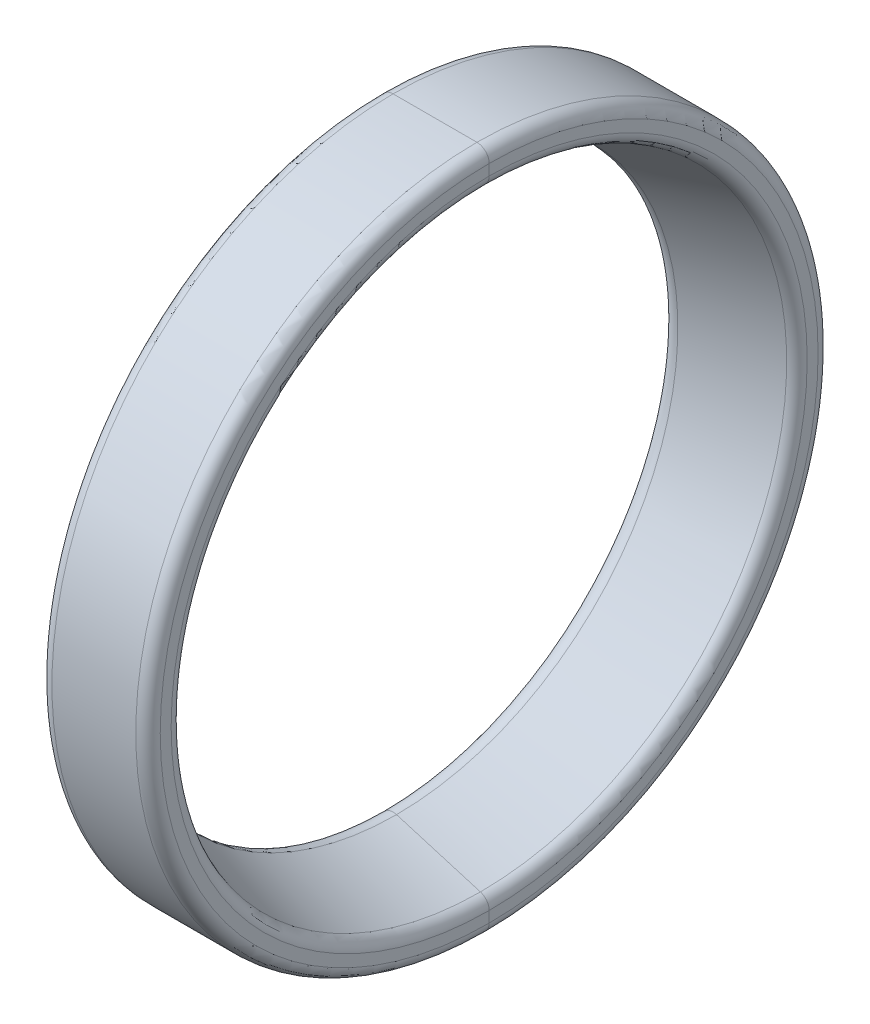
ISO-10303-21;
HEADER;
FILE_DESCRIPTION(('STEP AP214'),'2;1');
FILE_NAME('part.step','',(''),(''),'','','');
FILE_SCHEMA(('AUTOMOTIVE_DESIGN { 1 0 10303 214 1 1 1 1 }'));
ENDSEC;
DATA;
#1=APPLICATION_CONTEXT('core data for automotive mechanical design processes');
#2=APPLICATION_PROTOCOL_DEFINITION('international standard','automotive_design',2000,#1);
#3=PRODUCT_CONTEXT('',#1,'mechanical');
#4=PRODUCT('Part','Part','',(#3));
#5=PRODUCT_RELATED_PRODUCT_CATEGORY('part','',(#4));
#6=PRODUCT_DEFINITION_FORMATION('','',#4);
#7=PRODUCT_DEFINITION_CONTEXT('part definition',#1,'design');
#8=PRODUCT_DEFINITION('design','',#6,#7);
#9=PRODUCT_DEFINITION_SHAPE('','',#8);
#10=(LENGTH_UNIT() NAMED_UNIT(*) SI_UNIT(.MILLI.,.METRE.));
#11=(NAMED_UNIT(*) PLANE_ANGLE_UNIT() SI_UNIT($,.RADIAN.));
#12=(NAMED_UNIT(*) SI_UNIT($,.STERADIAN.) SOLID_ANGLE_UNIT());
#13=UNCERTAINTY_MEASURE_WITH_UNIT(LENGTH_MEASURE(1.E-05),#10,'distance_accuracy_value','');
#14=(GEOMETRIC_REPRESENTATION_CONTEXT(3) GLOBAL_UNCERTAINTY_ASSIGNED_CONTEXT((#13)) GLOBAL_UNIT_ASSIGNED_CONTEXT((#10,
#11,#12)) REPRESENTATION_CONTEXT('',''));
#15=CARTESIAN_POINT('',(0.,0.,0.));
#16=DIRECTION('',(0.,0.,1.));
#17=DIRECTION('',(1.,0.,0.));
#18=AXIS2_PLACEMENT_3D('',#15,#16,#17);
#19=CARTESIAN_POINT('',(5.22351000000001,0.,0.));
#20=DIRECTION('',(-1.,0.,0.));
#21=DIRECTION('',(0.,0.,1.));
#22=AXIS2_PLACEMENT_3D('',#19,#20,#21);
#23=TOROIDAL_SURFACE('',#22,40.97655,1.524);
#24=CARTESIAN_POINT('',(6.74751000000001,0.,0.));
#25=DIRECTION('',(-1.,0.,0.));
#26=DIRECTION('',(0.,0.,1.));
#27=AXIS2_PLACEMENT_3D('',#24,#25,#26);
#28=CIRCLE('',#27,40.97655);
#29=CARTESIAN_POINT('',(6.74751000000001,40.97655,2.86137719310345E-13));
#30=VERTEX_POINT('',#29);
#31=CARTESIAN_POINT('',(6.74751000000001,-40.97655,0.));
#32=VERTEX_POINT('',#31);
#33=EDGE_CURVE('E12',#30,#32,#28,.T.);
#34=ORIENTED_EDGE('',*,*,#33,.T.);
#35=CARTESIAN_POINT('',(5.22351000000001,-40.97655,0.));
#36=DIRECTION('',(0.,0.,1.));
#37=DIRECTION('',(1.,0.,0.));
#38=AXIS2_PLACEMENT_3D('',#35,#36,#37);
#39=CIRCLE('',#38,1.524);
#40=CARTESIAN_POINT('',(5.22351000000001,-42.50055,0.));
#41=VERTEX_POINT('',#40);
#42=EDGE_CURVE('E107',#41,#32,#39,.T.);
#43=ORIENTED_EDGE('',*,*,#42,.F.);
#44=CARTESIAN_POINT('',(5.22351000000001,0.,0.));
#45=DIRECTION('',(-1.,0.,0.));
#46=DIRECTION('',(0.,0.,1.));
#47=AXIS2_PLACEMENT_3D('',#44,#45,#46);
#48=CIRCLE('',#47,42.50055);
#49=CARTESIAN_POINT('',(5.22351000000001,42.50055,2.96779754431139E-13));
#50=VERTEX_POINT('',#49);
#51=EDGE_CURVE('E58',#50,#41,#48,.T.);
#52=ORIENTED_EDGE('',*,*,#51,.F.);
#53=CARTESIAN_POINT('',(5.22351000000001,40.97655,2.86137719310345E-13));
#54=DIRECTION('',(0.,0.,-1.));
#55=DIRECTION('',(1.,0.,0.));
#56=AXIS2_PLACEMENT_3D('',#53,#54,#55);
#57=CIRCLE('',#56,1.524);
#58=EDGE_CURVE('E109',#50,#30,#57,.T.);
#59=ORIENTED_EDGE('',*,*,#58,.T.);
#60=EDGE_LOOP('',(#34,#43,#52,#59));
#61=FACE_BOUND('',#60,.T.);
#62=ADVANCED_FACE('F43',(#61),#23,.T.);
#63=CARTESIAN_POINT('',(6.74751000000001,40.97655,2.86137719310345E-13));
#64=DIRECTION('',(1.,0.,0.));
#65=DIRECTION('',(0.,0.,-1.));
#66=AXIS2_PLACEMENT_3D('',#63,#64,#65);
#67=PLANE('',#66);
#68=CARTESIAN_POINT('',(6.74751000000001,0.,0.));
#69=DIRECTION('',(-1.,0.,0.));
#70=DIRECTION('',(0.,0.,1.));
#71=AXIS2_PLACEMENT_3D('',#68,#69,#70);
#72=CIRCLE('',#71,39.6172361810625);
#73=CARTESIAN_POINT('',(6.74751000000001,39.6172361810625,2.76645681645441E-13));
#74=VERTEX_POINT('',#73);
#75=CARTESIAN_POINT('',(6.74751000000001,-39.6172361810625,0.));
#76=VERTEX_POINT('',#75);
#77=EDGE_CURVE('E51',#74,#76,#72,.T.);
#78=ORIENTED_EDGE('',*,*,#77,.T.);
#79=DIRECTION('',(0.,1.,0.));
#80=VECTOR('',#79,1.);
#81=CARTESIAN_POINT('',(6.74751000000001,-40.97655,0.));
#82=LINE('',#81,#80);
#83=EDGE_CURVE('E118',#32,#76,#82,.T.);
#84=ORIENTED_EDGE('',*,*,#83,.F.);
#85=ORIENTED_EDGE('',*,*,#33,.F.);
#86=DIRECTION('',(0.,-1.,0.));
#87=VECTOR('',#86,1.);
#88=CARTESIAN_POINT('',(6.74751000000001,40.97655,2.86137719310345E-13));
#89=LINE('',#88,#87);
#90=EDGE_CURVE('E140',#30,#74,#89,.T.);
#91=ORIENTED_EDGE('',*,*,#90,.T.);
#92=EDGE_LOOP('',(#78,#84,#85,#91));
#93=FACE_BOUND('',#92,.T.);
#94=ADVANCED_FACE('F45',(#93),#67,.T.);
#95=CARTESIAN_POINT('',(5.22351000000001,0.,0.));
#96=DIRECTION('',(-1.,0.,0.));
#97=DIRECTION('',(0.,0.,1.));
#98=AXIS2_PLACEMENT_3D('',#95,#96,#97);
#99=TOROIDAL_SURFACE('',#98,39.6172361810625,1.524);
#100=CARTESIAN_POINT('',(5.65855214200513,0.,0.));
#101=DIRECTION('',(-1.,0.,0.));
#102=DIRECTION('',(0.,0.,1.));
#103=AXIS2_PLACEMENT_3D('',#100,#101,#102);
#104=CIRCLE('',#103,38.156649198141);
#105=CARTESIAN_POINT('',(5.65855214200513,38.156649198141,2.66446457256186E-13));
#106=VERTEX_POINT('',#105);
#107=CARTESIAN_POINT('',(5.65855214200513,-38.156649198141,0.));
#108=VERTEX_POINT('',#107);
#109=EDGE_CURVE('E166',#106,#108,#104,.T.);
#110=ORIENTED_EDGE('',*,*,#109,.T.);
#111=CARTESIAN_POINT('',(5.22351000000001,-39.6172361810625,0.));
#112=DIRECTION('',(0.,0.,1.));
#113=DIRECTION('',(1.,0.,0.));
#114=AXIS2_PLACEMENT_3D('',#111,#112,#113);
#115=CIRCLE('',#114,1.524);
#116=EDGE_CURVE('E123',#76,#108,#115,.T.);
#117=ORIENTED_EDGE('',*,*,#116,.F.);
#118=ORIENTED_EDGE('',*,*,#77,.F.);
#119=CARTESIAN_POINT('',(5.22351000000001,39.6172361810625,2.76645681645441E-13));
#120=DIRECTION('',(0.,0.,-1.));
#121=DIRECTION('',(1.,0.,0.));
#122=AXIS2_PLACEMENT_3D('',#119,#120,#121);
#123=CIRCLE('',#122,1.524);
#124=EDGE_CURVE('E142',#74,#106,#123,.T.);
#125=ORIENTED_EDGE('',*,*,#124,.T.);
#126=EDGE_LOOP('',(#110,#117,#118,#125));
#127=FACE_BOUND('',#126,.T.);
#128=ADVANCED_FACE('F168',(#127),#99,.T.);
#129=CARTESIAN_POINT('',(5.65855214200513,0.,0.));
#130=DIRECTION('',(1.,0.,0.));
#131=DIRECTION('',(0.,0.,-1.));
#132=AXIS2_PLACEMENT_3D('',#129,#130,#131);
#133=CONICAL_SURFACE('',#132,38.156649198141,0.289487119689315);
#134=CARTESIAN_POINT('',(-4.78846785799487,0.,0.));
#135=DIRECTION('',(-1.,0.,0.));
#136=DIRECTION('',(0.,0.,1.));
#137=AXIS2_PLACEMENT_3D('',#134,#135,#136);
#138=CIRCLE('',#137,35.0449591642618);
#139=CARTESIAN_POINT('',(-4.78846785799487,35.0449591642618,2.4471764188508E-13));
#140=VERTEX_POINT('',#139);
#141=CARTESIAN_POINT('',(-4.78846785799487,-35.0449591642618,0.));
#142=VERTEX_POINT('',#141);
#143=EDGE_CURVE('E164',#140,#142,#138,.T.);
#144=ORIENTED_EDGE('',*,*,#143,.T.);
#145=DIRECTION('',(-0.958390408741112,0.285460723100473,0.));
#146=VECTOR('',#145,1.);
#147=CARTESIAN_POINT('',(-4.78846785799487,-35.0449591642618,0.));
#148=LINE('',#147,#146);
#149=EDGE_CURVE('E125',#108,#142,#148,.T.);
#150=ORIENTED_EDGE('',*,*,#149,.F.);
#151=ORIENTED_EDGE('',*,*,#109,.F.);
#152=DIRECTION('',(-0.958390408741112,-0.285460723100473,0.));
#153=VECTOR('',#152,1.);
#154=CARTESIAN_POINT('',(-4.78846785799487,35.0449591642618,2.4471764188508E-13));
#155=LINE('',#154,#153);
#156=EDGE_CURVE('E145',#106,#140,#155,.T.);
#157=ORIENTED_EDGE('',*,*,#156,.T.);
#158=EDGE_LOOP('',(#144,#150,#151,#157));
#159=FACE_BOUND('',#158,.T.);
#160=ADVANCED_FACE('F174',(#159),#133,.F.);
#161=CARTESIAN_POINT('',(-5.22350999999999,0.,0.));
#162=DIRECTION('',(-1.,0.,0.));
#163=DIRECTION('',(0.,0.,1.));
#164=AXIS2_PLACEMENT_3D('',#161,#162,#163);
#165=TOROIDAL_SURFACE('',#164,36.5055461471833,1.524);
#166=CARTESIAN_POINT('',(-6.74750999999998,0.,0.));
#167=DIRECTION('',(-1.,0.,0.));
#168=DIRECTION('',(0.,0.,1.));
#169=AXIS2_PLACEMENT_3D('',#166,#167,#168);
#170=CIRCLE('',#169,36.5055461471833);
#171=CARTESIAN_POINT('',(-6.74750999999999,36.5055461471833,2.54916866274335E-13));
#172=VERTEX_POINT('',#171);
#173=CARTESIAN_POINT('',(-6.74750999999999,-36.5055461471833,0.));
#174=VERTEX_POINT('',#173);
#175=EDGE_CURVE('E162',#172,#174,#170,.T.);
#176=ORIENTED_EDGE('',*,*,#175,.T.);
#177=CARTESIAN_POINT('',(-5.22350999999999,-36.5055461471833,0.));
#178=DIRECTION('',(0.,0.,1.));
#179=DIRECTION('',(-1.,0.,0.));
#180=AXIS2_PLACEMENT_3D('',#177,#178,#179);
#181=CIRCLE('',#180,1.524);
#182=EDGE_CURVE('E130',#142,#174,#181,.T.);
#183=ORIENTED_EDGE('',*,*,#182,.F.);
#184=ORIENTED_EDGE('',*,*,#143,.F.);
#185=CARTESIAN_POINT('',(-5.22350999999999,36.5055461471833,2.54916866274335E-13));
#186=DIRECTION('',(0.,0.,-1.));
#187=DIRECTION('',(-1.,0.,0.));
#188=AXIS2_PLACEMENT_3D('',#185,#186,#187);
#189=CIRCLE('',#188,1.524);
#190=EDGE_CURVE('E148',#140,#172,#189,.T.);
#191=ORIENTED_EDGE('',*,*,#190,.T.);
#192=EDGE_LOOP('',(#176,#183,#184,#191));
#193=FACE_BOUND('',#192,.T.);
#194=ADVANCED_FACE('F177',(#193),#165,.T.);
#195=CARTESIAN_POINT('',(-6.74750999999999,40.97655,2.86137719310345E-13));
#196=DIRECTION('',(-1.,0.,0.));
#197=DIRECTION('',(0.,0.,1.));
#198=AXIS2_PLACEMENT_3D('',#195,#196,#197);
#199=PLANE('',#198);
#200=CARTESIAN_POINT('',(-6.74750999999998,0.,0.));
#201=DIRECTION('',(-1.,0.,0.));
#202=DIRECTION('',(0.,0.,1.));
#203=AXIS2_PLACEMENT_3D('',#200,#201,#202);
#204=CIRCLE('',#203,40.97655);
#205=CARTESIAN_POINT('',(-6.74750999999999,40.97655,2.86137719310345E-13));
#206=VERTEX_POINT('',#205);
#207=CARTESIAN_POINT('',(-6.74750999999999,-40.97655,0.));
#208=VERTEX_POINT('',#207);
#209=EDGE_CURVE('E160',#206,#208,#204,.T.);
#210=ORIENTED_EDGE('',*,*,#209,.T.);
#211=DIRECTION('',(0.,-1.,0.));
#212=VECTOR('',#211,1.);
#213=CARTESIAN_POINT('',(-6.74750999999999,-40.97655,0.));
#214=LINE('',#213,#212);
#215=EDGE_CURVE('E133',#174,#208,#214,.T.);
#216=ORIENTED_EDGE('',*,*,#215,.F.);
#217=ORIENTED_EDGE('',*,*,#175,.F.);
#218=DIRECTION('',(0.,1.,0.));
#219=VECTOR('',#218,1.);
#220=CARTESIAN_POINT('',(-6.74750999999999,40.97655,2.86137719310345E-13));
#221=LINE('',#220,#219);
#222=EDGE_CURVE('E151',#172,#206,#221,.T.);
#223=ORIENTED_EDGE('',*,*,#222,.T.);
#224=EDGE_LOOP('',(#210,#216,#217,#223));
#225=FACE_BOUND('',#224,.T.);
#226=ADVANCED_FACE('F182',(#225),#199,.T.);
#227=CARTESIAN_POINT('',(-5.22350999999999,0.,0.));
#228=DIRECTION('',(-1.,0.,0.));
#229=DIRECTION('',(0.,0.,1.));
#230=AXIS2_PLACEMENT_3D('',#227,#228,#229);
#231=TOROIDAL_SURFACE('',#230,40.97655,1.524);
#232=CARTESIAN_POINT('',(-5.22350999999999,0.,0.));
#233=DIRECTION('',(-1.,0.,0.));
#234=DIRECTION('',(0.,0.,1.));
#235=AXIS2_PLACEMENT_3D('',#232,#233,#234);
#236=CIRCLE('',#235,42.50055);
#237=CARTESIAN_POINT('',(-5.22350999999999,42.50055,2.96779754431139E-13));
#238=VERTEX_POINT('',#237);
#239=CARTESIAN_POINT('',(-5.22350999999999,-42.50055,0.));
#240=VERTEX_POINT('',#239);
#241=EDGE_CURVE('E66',#238,#240,#236,.T.);
#242=ORIENTED_EDGE('',*,*,#241,.T.);
#243=CARTESIAN_POINT('',(-5.22350999999999,-40.97655,0.));
#244=DIRECTION('',(0.,0.,1.));
#245=DIRECTION('',(-1.,0.,0.));
#246=AXIS2_PLACEMENT_3D('',#243,#244,#245);
#247=CIRCLE('',#246,1.524);
#248=EDGE_CURVE('E136',#208,#240,#247,.T.);
#249=ORIENTED_EDGE('',*,*,#248,.F.);
#250=ORIENTED_EDGE('',*,*,#209,.F.);
#251=CARTESIAN_POINT('',(-5.22350999999999,40.97655,2.86137719310345E-13));
#252=DIRECTION('',(0.,0.,-1.));
#253=DIRECTION('',(-1.,0.,0.));
#254=AXIS2_PLACEMENT_3D('',#251,#252,#253);
#255=CIRCLE('',#254,1.524);
#256=EDGE_CURVE('E154',#206,#238,#255,.T.);
#257=ORIENTED_EDGE('',*,*,#256,.T.);
#258=EDGE_LOOP('',(#242,#249,#250,#257));
#259=FACE_BOUND('',#258,.T.);
#260=ADVANCED_FACE('F185',(#259),#231,.T.);
#261=CARTESIAN_POINT('',(-71.3482152595,0.,0.));
#262=DIRECTION('',(-1.,0.,0.));
#263=DIRECTION('',(0.,0.,1.));
#264=AXIS2_PLACEMENT_3D('',#261,#262,#263);
#265=CYLINDRICAL_SURFACE('',#264,42.50055);
#266=DIRECTION('',(1.,0.,0.));
#267=VECTOR('',#266,1.);
#268=CARTESIAN_POINT('',(-5.22350999999999,42.50055,2.96779754431139E-13));
#269=LINE('',#268,#267);
#270=EDGE_CURVE('E156',#238,#50,#269,.T.);
#271=ORIENTED_EDGE('',*,*,#270,.T.);
#272=ORIENTED_EDGE('',*,*,#51,.T.);
#273=DIRECTION('',(1.,0.,0.));
#274=VECTOR('',#273,1.);
#275=CARTESIAN_POINT('',(-5.22350999999999,-42.50055,0.));
#276=LINE('',#275,#274);
#277=EDGE_CURVE('E121',#240,#41,#276,.T.);
#278=ORIENTED_EDGE('',*,*,#277,.F.);
#279=ORIENTED_EDGE('',*,*,#241,.F.);
#280=EDGE_LOOP('',(#271,#272,#278,#279));
#281=FACE_BOUND('',#280,.T.);
#282=ADVANCED_FACE('F187',(#281),#265,.T.);
#283=CARTESIAN_POINT('',(5.22351000000001,40.97655,2.86137719310345E-13));
#284=DIRECTION('',(0.,0.,-1.));
#285=DIRECTION('',(1.,0.,0.));
#286=AXIS2_PLACEMENT_3D('',#283,#284,#285);
#287=PLANE('',#286);
#288=ORIENTED_EDGE('',*,*,#58,.F.);
#289=ORIENTED_EDGE('',*,*,#270,.F.);
#290=ORIENTED_EDGE('',*,*,#256,.F.);
#291=ORIENTED_EDGE('',*,*,#222,.F.);
#292=ORIENTED_EDGE('',*,*,#190,.F.);
#293=ORIENTED_EDGE('',*,*,#156,.F.);
#294=ORIENTED_EDGE('',*,*,#124,.F.);
#295=ORIENTED_EDGE('',*,*,#90,.F.);
#296=EDGE_LOOP('',(#288,#289,#290,#291,#292,#293,#294,#295));
#297=FACE_BOUND('',#296,.T.);
#298=ADVANCED_FACE('F189',(#297),#287,.F.);
#299=CARTESIAN_POINT('',(5.22351000000001,-40.97655,0.));
#300=DIRECTION('',(0.,0.,1.));
#301=DIRECTION('',(1.,0.,0.));
#302=AXIS2_PLACEMENT_3D('',#299,#300,#301);
#303=PLANE('',#302);
#304=ORIENTED_EDGE('',*,*,#42,.T.);
#305=ORIENTED_EDGE('',*,*,#83,.T.);
#306=ORIENTED_EDGE('',*,*,#116,.T.);
#307=ORIENTED_EDGE('',*,*,#149,.T.);
#308=ORIENTED_EDGE('',*,*,#182,.T.);
#309=ORIENTED_EDGE('',*,*,#215,.T.);
#310=ORIENTED_EDGE('',*,*,#248,.T.);
#311=ORIENTED_EDGE('',*,*,#277,.T.);
#312=EDGE_LOOP('',(#304,#305,#306,#307,#308,#309,#310,#311));
#313=FACE_BOUND('',#312,.T.);
#314=ADVANCED_FACE('F116',(#313),#303,.T.);
#315=CLOSED_SHELL('',(#62,#94,#128,#160,#194,#226,#260,#282,#298,#314));
#316=MANIFOLD_SOLID_BREP('B2',#315);
#317=CARTESIAN_POINT('',(5.22351000000001,0.,0.));
#318=DIRECTION('',(-1.,0.,0.));
#319=DIRECTION('',(0.,0.,1.));
#320=AXIS2_PLACEMENT_3D('',#317,#318,#319);
#321=TOROIDAL_SURFACE('',#320,39.6172361810625,1.524);
#322=CARTESIAN_POINT('',(5.65855214200513,0.,0.));
#323=DIRECTION('',(-1.,0.,0.));
#324=DIRECTION('',(0.,0.,1.));
#325=AXIS2_PLACEMENT_3D('',#322,#323,#324);
#326=CIRCLE('',#325,38.156649198141);
#327=CARTESIAN_POINT('',(5.65855214200513,-38.156649198141,-2.66446457256186E-13));
#328=VERTEX_POINT('',#327);
#329=CARTESIAN_POINT('',(5.65855214200513,38.156649198141,0.));
#330=VERTEX_POINT('',#329);
#331=EDGE_CURVE('E41',#328,#330,#326,.T.);
#332=ORIENTED_EDGE('',*,*,#331,.T.);
#333=CARTESIAN_POINT('',(5.22351000000001,39.6172361810625,0.));
#334=DIRECTION('',(0.,0.,1.));
#335=DIRECTION('',(-1.,0.,0.));
#336=AXIS2_PLACEMENT_3D('',#333,#334,#335);
#337=CIRCLE('',#336,1.524);
#338=CARTESIAN_POINT('',(6.74751000000001,39.6172361810625,0.));
#339=VERTEX_POINT('',#338);
#340=EDGE_CURVE('E353',#330,#339,#337,.T.);
#341=ORIENTED_EDGE('',*,*,#340,.T.);
#342=CARTESIAN_POINT('',(6.74751000000001,0.,0.));
#343=DIRECTION('',(-1.,0.,0.));
#344=DIRECTION('',(0.,0.,1.));
#345=AXIS2_PLACEMENT_3D('',#342,#343,#344);
#346=CIRCLE('',#345,39.6172361810625);
#347=CARTESIAN_POINT('',(6.74751000000001,-39.6172361810625,-2.76645681645441E-13));
#348=VERTEX_POINT('',#347);
#349=EDGE_CURVE('E335',#348,#339,#346,.T.);
#350=ORIENTED_EDGE('',*,*,#349,.F.);
#351=CARTESIAN_POINT('',(5.22351000000001,-39.6172361810625,-2.76645681645441E-13));
#352=DIRECTION('',(0.,0.,-1.));
#353=DIRECTION('',(-1.,0.,0.));
#354=AXIS2_PLACEMENT_3D('',#351,#352,#353);
#355=CIRCLE('',#354,1.524);
#356=EDGE_CURVE('E374',#328,#348,#355,.T.);
#357=ORIENTED_EDGE('',*,*,#356,.F.);
#358=EDGE_LOOP('',(#332,#341,#350,#357));
#359=FACE_BOUND('',#358,.T.);
#360=ADVANCED_FACE('F271',(#359),#321,.T.);
#361=CARTESIAN_POINT('',(-4.78846785799487,0.,0.));
#362=DIRECTION('',(1.,0.,0.));
#363=DIRECTION('',(0.,0.,-1.));
#364=AXIS2_PLACEMENT_3D('',#361,#362,#363);
#365=CONICAL_SURFACE('',#364,35.0449591642618,0.289487119689315);
#366=CARTESIAN_POINT('',(-4.78846785799487,0.,0.));
#367=DIRECTION('',(-1.,0.,0.));
#368=DIRECTION('',(0.,0.,1.));
#369=AXIS2_PLACEMENT_3D('',#366,#367,#368);
#370=CIRCLE('',#369,35.0449591642618);
#371=CARTESIAN_POINT('',(-4.78846785799487,-35.0449591642618,-2.4471764188508E-13));
#372=VERTEX_POINT('',#371);
#373=CARTESIAN_POINT('',(-4.78846785799487,35.0449591642618,0.));
#374=VERTEX_POINT('',#373);
#375=EDGE_CURVE('E279',#372,#374,#370,.T.);
#376=ORIENTED_EDGE('',*,*,#375,.T.);
#377=DIRECTION('',(0.958390408741112,0.285460723100473,0.));
#378=VECTOR('',#377,1.);
#379=CARTESIAN_POINT('',(-4.78846785799487,35.0449591642618,0.));
#380=LINE('',#379,#378);
#381=EDGE_CURVE('E372',#374,#330,#380,.T.);
#382=ORIENTED_EDGE('',*,*,#381,.T.);
#383=ORIENTED_EDGE('',*,*,#331,.F.);
#384=DIRECTION('',(0.958390408741112,-0.285460723100473,0.));
#385=VECTOR('',#384,1.);
#386=CARTESIAN_POINT('',(-4.78846785799487,-35.0449591642618,-2.4471764188508E-13));
#387=LINE('',#386,#385);
#388=EDGE_CURVE('E347',#372,#328,#387,.T.);
#389=ORIENTED_EDGE('',*,*,#388,.F.);
#390=EDGE_LOOP('',(#376,#382,#383,#389));
#391=FACE_BOUND('',#390,.T.);
#392=ADVANCED_FACE('F273',(#391),#365,.F.);
#393=CARTESIAN_POINT('',(-5.22350999999999,0.,0.));
#394=DIRECTION('',(-1.,0.,0.));
#395=DIRECTION('',(0.,0.,1.));
#396=AXIS2_PLACEMENT_3D('',#393,#394,#395);
#397=TOROIDAL_SURFACE('',#396,36.5055461471833,1.524);
#398=CARTESIAN_POINT('',(-6.74750999999998,0.,0.));
#399=DIRECTION('',(-1.,0.,0.));
#400=DIRECTION('',(0.,0.,1.));
#401=AXIS2_PLACEMENT_3D('',#398,#399,#400);
#402=CIRCLE('',#401,36.5055461471833);
#403=CARTESIAN_POINT('',(-6.74750999999999,-36.5055461471833,-2.54916866274335E-13));
#404=VERTEX_POINT('',#403);
#405=CARTESIAN_POINT('',(-6.74750999999999,36.5055461471833,0.));
#406=VERTEX_POINT('',#405);
#407=EDGE_CURVE('E399',#404,#406,#402,.T.);
#408=ORIENTED_EDGE('',*,*,#407,.T.);
#409=CARTESIAN_POINT('',(-5.22350999999999,36.5055461471833,0.));
#410=DIRECTION('',(0.,0.,1.));
#411=DIRECTION('',(1.,0.,0.));
#412=AXIS2_PLACEMENT_3D('',#409,#410,#411);
#413=CIRCLE('',#412,1.524);
#414=EDGE_CURVE('E370',#406,#374,#413,.T.);
#415=ORIENTED_EDGE('',*,*,#414,.T.);
#416=ORIENTED_EDGE('',*,*,#375,.F.);
#417=CARTESIAN_POINT('',(-5.22350999999999,-36.5055461471833,-2.54916866274335E-13));
#418=DIRECTION('',(0.,0.,-1.));
#419=DIRECTION('',(1.,0.,0.));
#420=AXIS2_PLACEMENT_3D('',#417,#418,#419);
#421=CIRCLE('',#420,1.524);
#422=EDGE_CURVE('E389',#404,#372,#421,.T.);
#423=ORIENTED_EDGE('',*,*,#422,.F.);
#424=EDGE_LOOP('',(#408,#415,#416,#423));
#425=FACE_BOUND('',#424,.T.);
#426=ADVANCED_FACE('F401',(#425),#397,.T.);
#427=CARTESIAN_POINT('',(-6.74750999999999,-40.97655,-2.86137719310345E-13));
#428=DIRECTION('',(1.,0.,0.));
#429=DIRECTION('',(0.,0.,-1.));
#430=AXIS2_PLACEMENT_3D('',#427,#428,#429);
#431=PLANE('',#430);
#432=CARTESIAN_POINT('',(-6.74750999999998,0.,0.));
#433=DIRECTION('',(-1.,0.,0.));
#434=DIRECTION('',(0.,0.,1.));
#435=AXIS2_PLACEMENT_3D('',#432,#433,#434);
#436=CIRCLE('',#435,40.97655);
#437=CARTESIAN_POINT('',(-6.74750999999999,-40.97655,-2.86137719310345E-13));
#438=VERTEX_POINT('',#437);
#439=CARTESIAN_POINT('',(-6.74750999999999,40.97655,0.));
#440=VERTEX_POINT('',#439);
#441=EDGE_CURVE('E397',#438,#440,#436,.T.);
#442=ORIENTED_EDGE('',*,*,#441,.T.);
#443=DIRECTION('',(0.,-1.,0.));
#444=VECTOR('',#443,1.);
#445=CARTESIAN_POINT('',(-6.74750999999999,40.97655,0.));
#446=LINE('',#445,#444);
#447=EDGE_CURVE('E367',#440,#406,#446,.T.);
#448=ORIENTED_EDGE('',*,*,#447,.T.);
#449=ORIENTED_EDGE('',*,*,#407,.F.);
#450=DIRECTION('',(0.,1.,0.));
#451=VECTOR('',#450,1.);
#452=CARTESIAN_POINT('',(-6.74750999999999,-40.97655,-2.86137719310345E-13));
#453=LINE('',#452,#451);
#454=EDGE_CURVE('E386',#438,#404,#453,.T.);
#455=ORIENTED_EDGE('',*,*,#454,.F.);
#456=EDGE_LOOP('',(#442,#448,#449,#455));
#457=FACE_BOUND('',#456,.T.);
#458=ADVANCED_FACE('F405',(#457),#431,.F.);
#459=CARTESIAN_POINT('',(-5.22350999999999,0.,0.));
#460=DIRECTION('',(-1.,0.,0.));
#461=DIRECTION('',(0.,0.,1.));
#462=AXIS2_PLACEMENT_3D('',#459,#460,#461);
#463=TOROIDAL_SURFACE('',#462,40.97655,1.524);
#464=CARTESIAN_POINT('',(-5.22350999999999,0.,0.));
#465=DIRECTION('',(-1.,0.,0.));
#466=DIRECTION('',(0.,0.,1.));
#467=AXIS2_PLACEMENT_3D('',#464,#465,#466);
#468=CIRCLE('',#467,42.50055);
#469=CARTESIAN_POINT('',(-5.22350999999999,-42.50055,-2.96779754431139E-13));
#470=VERTEX_POINT('',#469);
#471=CARTESIAN_POINT('',(-5.22350999999999,42.50055,0.));
#472=VERTEX_POINT('',#471);
#473=EDGE_CURVE('E395',#470,#472,#468,.T.);
#474=ORIENTED_EDGE('',*,*,#473,.T.);
#475=CARTESIAN_POINT('',(-5.22350999999999,40.97655,0.));
#476=DIRECTION('',(0.,0.,1.));
#477=DIRECTION('',(1.,0.,0.));
#478=AXIS2_PLACEMENT_3D('',#475,#476,#477);
#479=CIRCLE('',#478,1.524);
#480=EDGE_CURVE('E364',#472,#440,#479,.T.);
#481=ORIENTED_EDGE('',*,*,#480,.T.);
#482=ORIENTED_EDGE('',*,*,#441,.F.);
#483=CARTESIAN_POINT('',(-5.22350999999999,-40.97655,-2.86137719310345E-13));
#484=DIRECTION('',(0.,0.,-1.));
#485=DIRECTION('',(1.,0.,0.));
#486=AXIS2_PLACEMENT_3D('',#483,#484,#485);
#487=CIRCLE('',#486,1.524);
#488=EDGE_CURVE('E383',#470,#438,#487,.T.);
#489=ORIENTED_EDGE('',*,*,#488,.F.);
#490=EDGE_LOOP('',(#474,#481,#482,#489));
#491=FACE_BOUND('',#490,.T.);
#492=ADVANCED_FACE('F409',(#491),#463,.T.);
#493=CARTESIAN_POINT('',(-71.3482152595,0.,0.));
#494=DIRECTION('',(-1.,0.,0.));
#495=DIRECTION('',(0.,0.,1.));
#496=AXIS2_PLACEMENT_3D('',#493,#494,#495);
#497=CYLINDRICAL_SURFACE('',#496,42.50055);
#498=CARTESIAN_POINT('',(5.22351000000001,0.,0.));
#499=DIRECTION('',(-1.,0.,0.));
#500=DIRECTION('',(0.,0.,1.));
#501=AXIS2_PLACEMENT_3D('',#498,#499,#500);
#502=CIRCLE('',#501,42.50055);
#503=CARTESIAN_POINT('',(5.22351000000001,-42.50055,-2.96779754431139E-13));
#504=VERTEX_POINT('',#503);
#505=CARTESIAN_POINT('',(5.22351000000001,42.50055,0.));
#506=VERTEX_POINT('',#505);
#507=EDGE_CURVE('E393',#504,#506,#502,.T.);
#508=ORIENTED_EDGE('',*,*,#507,.T.);
#509=DIRECTION('',(-1.,0.,0.));
#510=VECTOR('',#509,1.);
#511=CARTESIAN_POINT('',(-5.22350999999999,42.50055,0.));
#512=LINE('',#511,#510);
#513=EDGE_CURVE('E361',#506,#472,#512,.T.);
#514=ORIENTED_EDGE('',*,*,#513,.T.);
#515=ORIENTED_EDGE('',*,*,#473,.F.);
#516=DIRECTION('',(-1.,0.,0.));
#517=VECTOR('',#516,1.);
#518=CARTESIAN_POINT('',(-5.22350999999999,-42.50055,-2.96779754431139E-13));
#519=LINE('',#518,#517);
#520=EDGE_CURVE('E380',#504,#470,#519,.T.);
#521=ORIENTED_EDGE('',*,*,#520,.F.);
#522=EDGE_LOOP('',(#508,#514,#515,#521));
#523=FACE_BOUND('',#522,.T.);
#524=ADVANCED_FACE('F412',(#523),#497,.T.);
#525=CARTESIAN_POINT('',(5.22351000000001,0.,0.));
#526=DIRECTION('',(-1.,0.,0.));
#527=DIRECTION('',(0.,0.,1.));
#528=AXIS2_PLACEMENT_3D('',#525,#526,#527);
#529=TOROIDAL_SURFACE('',#528,40.97655,1.524);
#530=CARTESIAN_POINT('',(6.74751000000001,0.,0.));
#531=DIRECTION('',(-1.,0.,0.));
#532=DIRECTION('',(0.,0.,1.));
#533=AXIS2_PLACEMENT_3D('',#530,#531,#532);
#534=CIRCLE('',#533,40.97655);
#535=CARTESIAN_POINT('',(6.74751000000001,-40.97655,-2.86137719310345E-13));
#536=VERTEX_POINT('',#535);
#537=CARTESIAN_POINT('',(6.74751000000001,40.97655,0.));
#538=VERTEX_POINT('',#537);
#539=EDGE_CURVE('E346',#536,#538,#534,.T.);
#540=ORIENTED_EDGE('',*,*,#539,.T.);
#541=CARTESIAN_POINT('',(5.22351000000001,40.97655,0.));
#542=DIRECTION('',(0.,0.,1.));
#543=DIRECTION('',(-1.,0.,0.));
#544=AXIS2_PLACEMENT_3D('',#541,#542,#543);
#545=CIRCLE('',#544,1.524);
#546=EDGE_CURVE('E356',#538,#506,#545,.T.);
#547=ORIENTED_EDGE('',*,*,#546,.T.);
#548=ORIENTED_EDGE('',*,*,#507,.F.);
#549=CARTESIAN_POINT('',(5.22351000000001,-40.97655,-2.86137719310345E-13));
#550=DIRECTION('',(0.,0.,-1.));
#551=DIRECTION('',(-1.,0.,0.));
#552=AXIS2_PLACEMENT_3D('',#549,#550,#551);
#553=CIRCLE('',#552,1.524);
#554=EDGE_CURVE('E377',#536,#504,#553,.T.);
#555=ORIENTED_EDGE('',*,*,#554,.F.);
#556=EDGE_LOOP('',(#540,#547,#548,#555));
#557=FACE_BOUND('',#556,.T.);
#558=ADVANCED_FACE('F415',(#557),#529,.T.);
#559=CARTESIAN_POINT('',(6.74751000000001,-40.97655,-2.86137719310345E-13));
#560=DIRECTION('',(-1.,0.,0.));
#561=DIRECTION('',(0.,0.,1.));
#562=AXIS2_PLACEMENT_3D('',#559,#560,#561);
#563=PLANE('',#562);
#564=DIRECTION('',(0.,-1.,0.));
#565=VECTOR('',#564,1.);
#566=CARTESIAN_POINT('',(6.74751000000001,-40.97655,-2.86137719310345E-13));
#567=LINE('',#566,#565);
#568=EDGE_CURVE('E341',#348,#536,#567,.T.);
#569=ORIENTED_EDGE('',*,*,#568,.F.);
#570=ORIENTED_EDGE('',*,*,#349,.T.);
#571=DIRECTION('',(0.,1.,0.));
#572=VECTOR('',#571,1.);
#573=CARTESIAN_POINT('',(6.74751000000001,40.97655,0.));
#574=LINE('',#573,#572);
#575=EDGE_CURVE('E338',#339,#538,#574,.T.);
#576=ORIENTED_EDGE('',*,*,#575,.T.);
#577=ORIENTED_EDGE('',*,*,#539,.F.);
#578=EDGE_LOOP('',(#569,#570,#576,#577));
#579=FACE_BOUND('',#578,.T.);
#580=ADVANCED_FACE('F337',(#579),#563,.F.);
#581=CARTESIAN_POINT('',(5.22351000000001,-39.6172361810625,-2.76645681645441E-13));
#582=DIRECTION('',(0.,0.,1.));
#583=DIRECTION('',(-1.,0.,0.));
#584=AXIS2_PLACEMENT_3D('',#581,#582,#583);
#585=PLANE('',#584);
#586=ORIENTED_EDGE('',*,*,#356,.T.);
#587=ORIENTED_EDGE('',*,*,#568,.T.);
#588=ORIENTED_EDGE('',*,*,#554,.T.);
#589=ORIENTED_EDGE('',*,*,#520,.T.);
#590=ORIENTED_EDGE('',*,*,#488,.T.);
#591=ORIENTED_EDGE('',*,*,#454,.T.);
#592=ORIENTED_EDGE('',*,*,#422,.T.);
#593=ORIENTED_EDGE('',*,*,#388,.T.);
#594=EDGE_LOOP('',(#586,#587,#588,#589,#590,#591,#592,#593));
#595=FACE_BOUND('',#594,.T.);
#596=ADVANCED_FACE('F417',(#595),#585,.F.);
#597=CARTESIAN_POINT('',(5.22351000000001,39.6172361810625,0.));
#598=DIRECTION('',(0.,0.,-1.));
#599=DIRECTION('',(-1.,0.,0.));
#600=AXIS2_PLACEMENT_3D('',#597,#598,#599);
#601=PLANE('',#600);
#602=ORIENTED_EDGE('',*,*,#340,.F.);
#603=ORIENTED_EDGE('',*,*,#381,.F.);
#604=ORIENTED_EDGE('',*,*,#414,.F.);
#605=ORIENTED_EDGE('',*,*,#447,.F.);
#606=ORIENTED_EDGE('',*,*,#480,.F.);
#607=ORIENTED_EDGE('',*,*,#513,.F.);
#608=ORIENTED_EDGE('',*,*,#546,.F.);
#609=ORIENTED_EDGE('',*,*,#575,.F.);
#610=EDGE_LOOP('',(#602,#603,#604,#605,#606,#607,#608,#609));
#611=FACE_BOUND('',#610,.T.);
#612=ADVANCED_FACE('F351',(#611),#601,.T.);
#613=CLOSED_SHELL('',(#360,#392,#426,#458,#492,#524,#558,#580,#596,#612));
#614=MANIFOLD_SOLID_BREP('B6',#613);
#615=ADVANCED_BREP_SHAPE_REPRESENTATION('',(#18,#316,#614),#14);
#616=SHAPE_DEFINITION_REPRESENTATION(#9,#615);
ENDSEC;
END-ISO-10303-21;
